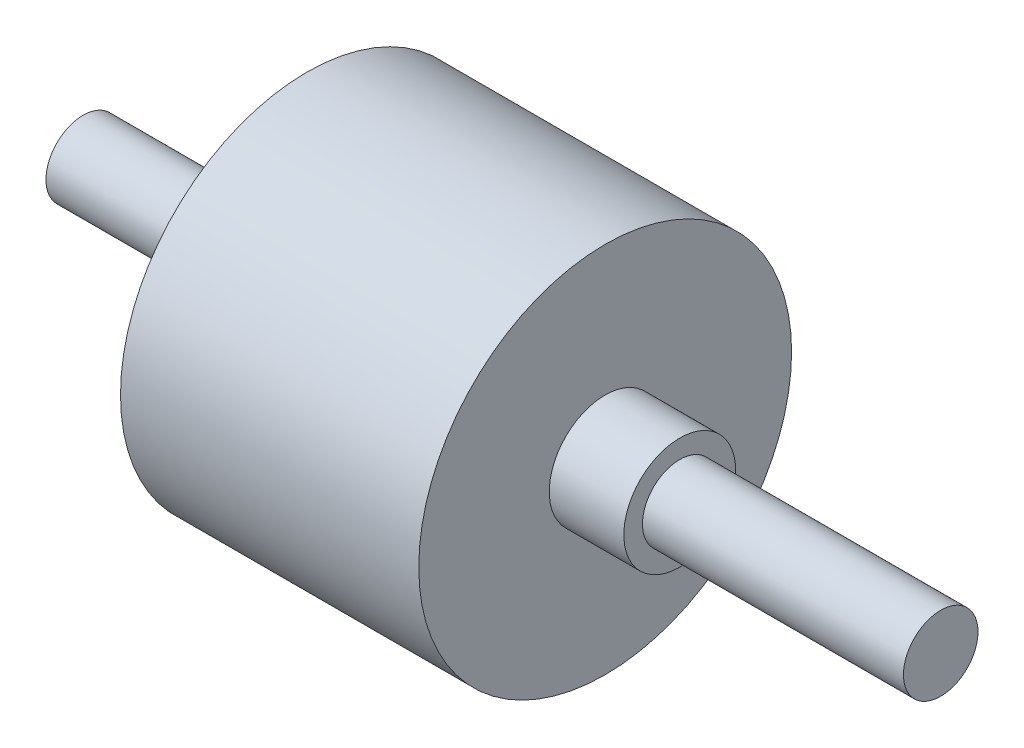
ISO-10303-21;
HEADER;
FILE_DESCRIPTION(('STEP AP214'),'2;1');
FILE_NAME('part.step','',(''),(''),'','','');
FILE_SCHEMA(('AUTOMOTIVE_DESIGN { 1 0 10303 214 1 1 1 1 }'));
ENDSEC;
DATA;
#1=APPLICATION_CONTEXT('core data for automotive mechanical design processes');
#2=APPLICATION_PROTOCOL_DEFINITION('international standard','automotive_design',2000,#1);
#3=PRODUCT_CONTEXT('',#1,'mechanical');
#4=PRODUCT('Part','Part','',(#3));
#5=PRODUCT_RELATED_PRODUCT_CATEGORY('part','',(#4));
#6=PRODUCT_DEFINITION_FORMATION('','',#4);
#7=PRODUCT_DEFINITION_CONTEXT('part definition',#1,'design');
#8=PRODUCT_DEFINITION('design','',#6,#7);
#9=PRODUCT_DEFINITION_SHAPE('','',#8);
#10=(LENGTH_UNIT() NAMED_UNIT(*) SI_UNIT(.MILLI.,.METRE.));
#11=(NAMED_UNIT(*) PLANE_ANGLE_UNIT() SI_UNIT($,.RADIAN.));
#12=(NAMED_UNIT(*) SI_UNIT($,.STERADIAN.) SOLID_ANGLE_UNIT());
#13=UNCERTAINTY_MEASURE_WITH_UNIT(LENGTH_MEASURE(1.E-05),#10,'distance_accuracy_value','');
#14=(GEOMETRIC_REPRESENTATION_CONTEXT(3) GLOBAL_UNCERTAINTY_ASSIGNED_CONTEXT((#13)) GLOBAL_UNIT_ASSIGNED_CONTEXT((#10,
#11,#12)) REPRESENTATION_CONTEXT('',''));
#15=CARTESIAN_POINT('',(0.,0.,0.));
#16=DIRECTION('',(0.,0.,1.));
#17=DIRECTION('',(1.,0.,0.));
#18=AXIS2_PLACEMENT_3D('',#15,#16,#17);
#19=CARTESIAN_POINT('',(40.,0.,0.));
#20=DIRECTION('',(-1.,0.,0.));
#21=DIRECTION('',(0.,0.,1.));
#22=AXIS2_PLACEMENT_3D('',#19,#20,#21);
#23=CYLINDRICAL_SURFACE('',#22,25.);
#24=CARTESIAN_POINT('',(40.,0.,0.));
#25=DIRECTION('',(1.,0.,0.));
#26=DIRECTION('',(0.,0.,-1.));
#27=AXIS2_PLACEMENT_3D('',#24,#25,#26);
#28=CIRCLE('',#27,25.);
#29=CARTESIAN_POINT('',(40.,0.,-25.));
#30=VERTEX_POINT('',#29);
#31=EDGE_CURVE('E55',#30,#30,#28,.T.);
#32=ORIENTED_EDGE('',*,*,#31,.F.);
#33=EDGE_LOOP('',(#32));
#34=FACE_BOUND('',#33,.T.);
#35=CARTESIAN_POINT('',(0.,0.,0.));
#36=DIRECTION('',(1.,0.,0.));
#37=DIRECTION('',(0.,0.,-1.));
#38=AXIS2_PLACEMENT_3D('',#35,#36,#37);
#39=CIRCLE('',#38,25.);
#40=CARTESIAN_POINT('',(0.,0.,-25.));
#41=VERTEX_POINT('',#40);
#42=EDGE_CURVE('E61',#41,#41,#39,.T.);
#43=ORIENTED_EDGE('',*,*,#42,.T.);
#44=EDGE_LOOP('',(#43));
#45=FACE_BOUND('',#44,.T.);
#46=ADVANCED_FACE('F43',(#34,#45),#23,.T.);
#47=CARTESIAN_POINT('',(40.,0.,0.));
#48=DIRECTION('',(1.,0.,0.));
#49=DIRECTION('',(0.,0.,-1.));
#50=AXIS2_PLACEMENT_3D('',#47,#48,#49);
#51=PLANE('',#50);
#52=CARTESIAN_POINT('',(40.,0.,0.));
#53=DIRECTION('',(1.,0.,0.));
#54=DIRECTION('',(0.,0.,-1.));
#55=AXIS2_PLACEMENT_3D('',#52,#53,#54);
#56=CIRCLE('',#55,7.5);
#57=CARTESIAN_POINT('',(40.,0.,-7.5));
#58=VERTEX_POINT('',#57);
#59=EDGE_CURVE('E50',#58,#58,#56,.T.);
#60=ORIENTED_EDGE('',*,*,#59,.F.);
#61=EDGE_LOOP('',(#60));
#62=FACE_BOUND('',#61,.T.);
#63=ORIENTED_EDGE('',*,*,#31,.T.);
#64=EDGE_LOOP('',(#63));
#65=FACE_BOUND('',#64,.T.);
#66=ADVANCED_FACE('F106',(#62,#65),#51,.T.);
#67=CARTESIAN_POINT('',(0.,0.,0.));
#68=DIRECTION('',(1.,0.,0.));
#69=DIRECTION('',(0.,0.,-1.));
#70=AXIS2_PLACEMENT_3D('',#67,#68,#69);
#71=PLANE('',#70);
#72=CARTESIAN_POINT('',(0.,0.,0.));
#73=DIRECTION('',(1.,0.,0.));
#74=DIRECTION('',(0.,0.,-1.));
#75=AXIS2_PLACEMENT_3D('',#72,#73,#74);
#76=CIRCLE('',#75,5.);
#77=CARTESIAN_POINT('',(0.,0.,-5.));
#78=VERTEX_POINT('',#77);
#79=EDGE_CURVE('E72',#78,#78,#76,.T.);
#80=ORIENTED_EDGE('',*,*,#79,.T.);
#81=EDGE_LOOP('',(#80));
#82=FACE_BOUND('',#81,.T.);
#83=ORIENTED_EDGE('',*,*,#42,.F.);
#84=EDGE_LOOP('',(#83));
#85=FACE_BOUND('',#84,.T.);
#86=ADVANCED_FACE('F111',(#82,#85),#71,.F.);
#87=CARTESIAN_POINT('',(50.,0.,0.));
#88=DIRECTION('',(-1.,0.,0.));
#89=DIRECTION('',(0.,0.,1.));
#90=AXIS2_PLACEMENT_3D('',#87,#88,#89);
#91=CYLINDRICAL_SURFACE('',#90,7.5);
#92=CARTESIAN_POINT('',(50.,0.,0.));
#93=DIRECTION('',(1.,0.,0.));
#94=DIRECTION('',(0.,0.,-1.));
#95=AXIS2_PLACEMENT_3D('',#92,#93,#94);
#96=CIRCLE('',#95,7.5);
#97=CARTESIAN_POINT('',(50.,0.,-7.5));
#98=VERTEX_POINT('',#97);
#99=EDGE_CURVE('E64',#98,#98,#96,.T.);
#100=ORIENTED_EDGE('',*,*,#99,.F.);
#101=EDGE_LOOP('',(#100));
#102=FACE_BOUND('',#101,.T.);
#103=ORIENTED_EDGE('',*,*,#59,.T.);
#104=EDGE_LOOP('',(#103));
#105=FACE_BOUND('',#104,.T.);
#106=ADVANCED_FACE('F120',(#102,#105),#91,.T.);
#107=CARTESIAN_POINT('',(50.,0.,0.));
#108=DIRECTION('',(1.,0.,0.));
#109=DIRECTION('',(0.,0.,-1.));
#110=AXIS2_PLACEMENT_3D('',#107,#108,#109);
#111=PLANE('',#110);
#112=CARTESIAN_POINT('',(50.,0.,0.));
#113=DIRECTION('',(1.,0.,0.));
#114=DIRECTION('',(0.,0.,-1.));
#115=AXIS2_PLACEMENT_3D('',#112,#113,#114);
#116=CIRCLE('',#115,5.);
#117=CARTESIAN_POINT('',(50.,0.,-5.));
#118=VERTEX_POINT('',#117);
#119=EDGE_CURVE('E10',#118,#118,#116,.T.);
#120=ORIENTED_EDGE('',*,*,#119,.F.);
#121=EDGE_LOOP('',(#120));
#122=FACE_BOUND('',#121,.T.);
#123=ORIENTED_EDGE('',*,*,#99,.T.);
#124=EDGE_LOOP('',(#123));
#125=FACE_BOUND('',#124,.T.);
#126=ADVANCED_FACE('F101',(#122,#125),#111,.T.);
#127=CARTESIAN_POINT('',(85.,0.,0.));
#128=DIRECTION('',(1.,0.,0.));
#129=DIRECTION('',(0.,0.,-1.));
#130=AXIS2_PLACEMENT_3D('',#127,#128,#129);
#131=PLANE('',#130);
#132=CARTESIAN_POINT('',(85.,0.,0.));
#133=DIRECTION('',(1.,0.,0.));
#134=DIRECTION('',(0.,0.,-1.));
#135=AXIS2_PLACEMENT_3D('',#132,#133,#134);
#136=CIRCLE('',#135,5.);
#137=CARTESIAN_POINT('',(85.,0.,-5.));
#138=VERTEX_POINT('',#137);
#139=EDGE_CURVE('E82',#138,#138,#136,.T.);
#140=ORIENTED_EDGE('',*,*,#139,.T.);
#141=EDGE_LOOP('',(#140));
#142=FACE_BOUND('',#141,.T.);
#143=ADVANCED_FACE('F89',(#142),#131,.T.);
#144=CARTESIAN_POINT('',(-30.,0.,0.));
#145=DIRECTION('',(1.,0.,0.));
#146=DIRECTION('',(0.,0.,-1.));
#147=AXIS2_PLACEMENT_3D('',#144,#145,#146);
#148=CYLINDRICAL_SURFACE('',#147,5.);
#149=ORIENTED_EDGE('',*,*,#119,.T.);
#150=EDGE_LOOP('',(#149));
#151=FACE_BOUND('',#150,.T.);
#152=ORIENTED_EDGE('',*,*,#139,.F.);
#153=EDGE_LOOP('',(#152));
#154=FACE_BOUND('',#153,.T.);
#155=ADVANCED_FACE('F91',(#151,#154),#148,.T.);
#156=CARTESIAN_POINT('',(-30.,0.,0.));
#157=DIRECTION('',(1.,0.,0.));
#158=DIRECTION('',(0.,0.,-1.));
#159=AXIS2_PLACEMENT_3D('',#156,#157,#158);
#160=CIRCLE('',#159,5.);
#161=CARTESIAN_POINT('',(-30.,0.,-5.));
#162=VERTEX_POINT('',#161);
#163=EDGE_CURVE('E77',#162,#162,#160,.T.);
#164=ORIENTED_EDGE('',*,*,#163,.T.);
#165=EDGE_LOOP('',(#164));
#166=FACE_BOUND('',#165,.T.);
#167=ORIENTED_EDGE('',*,*,#79,.F.);
#168=EDGE_LOOP('',(#167));
#169=FACE_BOUND('',#168,.T.);
#170=ADVANCED_FACE('F93',(#166,#169),#148,.T.);
#171=CARTESIAN_POINT('',(-30.,0.,0.));
#172=DIRECTION('',(1.,0.,0.));
#173=DIRECTION('',(0.,0.,-1.));
#174=AXIS2_PLACEMENT_3D('',#171,#172,#173);
#175=PLANE('',#174);
#176=ORIENTED_EDGE('',*,*,#163,.F.);
#177=EDGE_LOOP('',(#176));
#178=FACE_BOUND('',#177,.T.);
#179=ADVANCED_FACE('F99',(#178),#175,.F.);
#180=CLOSED_SHELL('',(#46,#66,#86,#106,#126,#143,#155,#170,#179));
#181=MANIFOLD_SOLID_BREP('B2',#180);
#182=ADVANCED_BREP_SHAPE_REPRESENTATION('',(#18,#181),#14);
#183=SHAPE_DEFINITION_REPRESENTATION(#9,#182);
ENDSEC;
END-ISO-10303-21;
